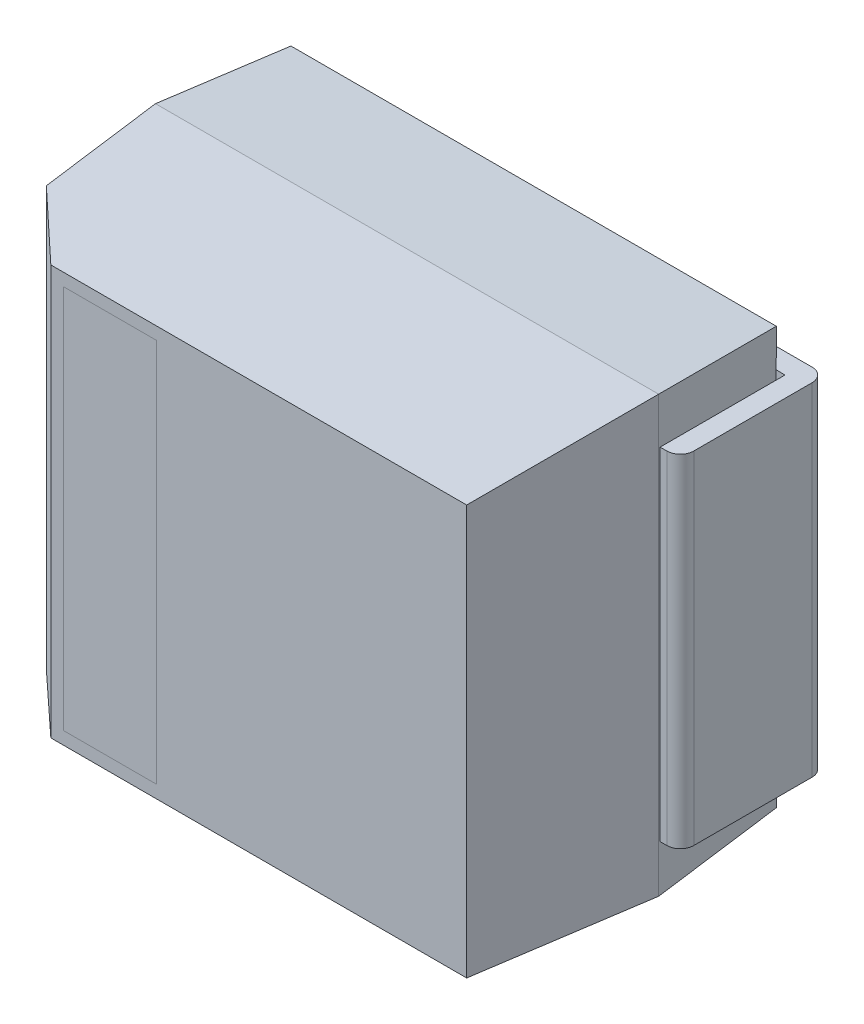
ISO-10303-21;
HEADER;
FILE_DESCRIPTION(('STEP AP214'),'2;1');
FILE_NAME('part.step','',(''),(''),'','','');
FILE_SCHEMA(('AUTOMOTIVE_DESIGN { 1 0 10303 214 1 1 1 1 }'));
ENDSEC;
DATA;
#1=APPLICATION_CONTEXT('core data for automotive mechanical design processes');
#2=APPLICATION_PROTOCOL_DEFINITION('international standard','automotive_design',2000,#1);
#3=PRODUCT_CONTEXT('',#1,'mechanical');
#4=PRODUCT('Part','Part','',(#3));
#5=PRODUCT_RELATED_PRODUCT_CATEGORY('part','',(#4));
#6=PRODUCT_DEFINITION_FORMATION('','',#4);
#7=PRODUCT_DEFINITION_CONTEXT('part definition',#1,'design');
#8=PRODUCT_DEFINITION('design','',#6,#7);
#9=PRODUCT_DEFINITION_SHAPE('','',#8);
#10=(LENGTH_UNIT() NAMED_UNIT(*) SI_UNIT(.MILLI.,.METRE.));
#11=(NAMED_UNIT(*) PLANE_ANGLE_UNIT() SI_UNIT($,.RADIAN.));
#12=(NAMED_UNIT(*) SI_UNIT($,.STERADIAN.) SOLID_ANGLE_UNIT());
#13=UNCERTAINTY_MEASURE_WITH_UNIT(LENGTH_MEASURE(1.E-05),#10,'distance_accuracy_value','');
#14=(GEOMETRIC_REPRESENTATION_CONTEXT(3) GLOBAL_UNCERTAINTY_ASSIGNED_CONTEXT((#13)) GLOBAL_UNIT_ASSIGNED_CONTEXT((#10,
#11,#12)) REPRESENTATION_CONTEXT('',''));
#15=CARTESIAN_POINT('',(0.,0.,0.));
#16=DIRECTION('',(0.,0.,1.));
#17=DIRECTION('',(1.,0.,0.));
#18=AXIS2_PLACEMENT_3D('',#15,#16,#17);
#19=CARTESIAN_POINT('',(-1.62,1.101,0.93655));
#20=DIRECTION('',(1.,0.,0.));
#21=DIRECTION('',(0.,-1.,0.));
#22=AXIS2_PLACEMENT_3D('',#19,#20,#21);
#23=PLANE('',#22);
#24=DIRECTION('',(0.,-1.,0.));
#25=VECTOR('',#24,1.);
#26=CARTESIAN_POINT('',(-1.62,0.,0.93555));
#27=LINE('',#26,#25);
#28=CARTESIAN_POINT('',(-1.62,-0.5,0.93555));
#29=VERTEX_POINT('',#28);
#30=CARTESIAN_POINT('',(-1.62,-1.1,0.93555));
#31=VERTEX_POINT('',#30);
#32=EDGE_CURVE('E462',#29,#31,#27,.T.);
#33=ORIENTED_EDGE('',*,*,#32,.T.);
#34=DIRECTION('',(0.,0.,-1.));
#35=VECTOR('',#34,1.);
#36=CARTESIAN_POINT('',(-1.62,-1.1,0.533425));
#37=LINE('',#36,#35);
#38=CARTESIAN_POINT('',(-1.62,-1.1,0.1313));
#39=VERTEX_POINT('',#38);
#40=EDGE_CURVE('E442',#31,#39,#37,.T.);
#41=ORIENTED_EDGE('',*,*,#40,.T.);
#42=DIRECTION('',(0.,-1.,0.));
#43=VECTOR('',#42,1.);
#44=CARTESIAN_POINT('',(-1.62,0.,0.1313));
#45=LINE('',#44,#43);
#46=CARTESIAN_POINT('',(-1.62,1.1,0.1313));
#47=VERTEX_POINT('',#46);
#48=EDGE_CURVE('E441',#47,#39,#45,.T.);
#49=ORIENTED_EDGE('',*,*,#48,.F.);
#50=DIRECTION('',(0.,0.,1.));
#51=VECTOR('',#50,1.);
#52=CARTESIAN_POINT('',(-1.62,1.1,0.533425));
#53=LINE('',#52,#51);
#54=CARTESIAN_POINT('',(-1.62,1.1,0.93555));
#55=VERTEX_POINT('',#54);
#56=EDGE_CURVE('E465',#47,#55,#53,.T.);
#57=ORIENTED_EDGE('',*,*,#56,.T.);
#58=DIRECTION('',(0.,-1.,0.));
#59=VECTOR('',#58,1.);
#60=CARTESIAN_POINT('',(-1.62,0.,0.93555));
#61=LINE('',#60,#59);
#62=CARTESIAN_POINT('',(-1.62,0.5,0.93555));
#63=VERTEX_POINT('',#62);
#64=EDGE_CURVE('E468',#55,#63,#61,.T.);
#65=ORIENTED_EDGE('',*,*,#64,.T.);
#66=DIRECTION('',(0.,0.,-1.));
#67=VECTOR('',#66,1.);
#68=CARTESIAN_POINT('',(-1.62,0.5,0.533425));
#69=LINE('',#68,#67);
#70=CARTESIAN_POINT('',(-1.62,0.5,0.5));
#71=VERTEX_POINT('',#70);
#72=EDGE_CURVE('E483',#63,#71,#69,.T.);
#73=ORIENTED_EDGE('',*,*,#72,.T.);
#74=DIRECTION('',(0.,-1.,0.));
#75=VECTOR('',#74,1.);
#76=CARTESIAN_POINT('',(-1.62,0.,0.5));
#77=LINE('',#76,#75);
#78=CARTESIAN_POINT('',(-1.62,-0.5,0.5));
#79=VERTEX_POINT('',#78);
#80=EDGE_CURVE('E478',#71,#79,#77,.T.);
#81=ORIENTED_EDGE('',*,*,#80,.T.);
#82=DIRECTION('',(0.,0.,1.));
#83=VECTOR('',#82,1.);
#84=CARTESIAN_POINT('',(-1.62,-0.5,0.533425));
#85=LINE('',#84,#83);
#86=EDGE_CURVE('E473',#79,#29,#85,.T.);
#87=ORIENTED_EDGE('',*,*,#86,.T.);
#88=EDGE_LOOP('',(#33,#41,#49,#57,#65,#73,#81,#87));
#89=FACE_BOUND('',#88,.T.);
#90=ADVANCED_FACE('F17',(#89),#23,.T.);
#91=CARTESIAN_POINT('',(-1.561820961401,-1.101,0.1313));
#92=DIRECTION('',(0.,0.,1.));
#93=DIRECTION('',(0.,1.,0.));
#94=AXIS2_PLACEMENT_3D('',#91,#92,#93);
#95=PLANE('',#94);
#96=ORIENTED_EDGE('',*,*,#48,.T.);
#97=DIRECTION('',(1.,0.,0.));
#98=VECTOR('',#97,1.);
#99=CARTESIAN_POINT('',(-1.5914104807005,-1.1,0.1313));
#100=LINE('',#99,#98);
#101=CARTESIAN_POINT('',(-1.56277528563014,-1.1,0.13064999999999));
#102=VERTEX_POINT('',#101);
#103=EDGE_CURVE('E445',#39,#102,#100,.T.);
#104=ORIENTED_EDGE('',*,*,#103,.T.);
#105=DIRECTION('',(0.,-1.,0.));
#106=VECTOR('',#105,1.);
#107=CARTESIAN_POINT('',(-1.56282096140156,0.,0.131299999999961));
#108=LINE('',#107,#106);
#109=CARTESIAN_POINT('',(-1.56277528563014,1.1,0.13064999999999));
#110=VERTEX_POINT('',#109);
#111=EDGE_CURVE('E750',#110,#102,#108,.T.);
#112=ORIENTED_EDGE('',*,*,#111,.F.);
#113=DIRECTION('',(-1.,0.,0.));
#114=VECTOR('',#113,1.);
#115=CARTESIAN_POINT('',(-1.5914104807005,1.1,0.1313));
#116=LINE('',#115,#114);
#117=EDGE_CURVE('E438',#110,#47,#116,.T.);
#118=ORIENTED_EDGE('',*,*,#117,.T.);
#119=EDGE_LOOP('',(#96,#104,#112,#118));
#120=FACE_BOUND('',#119,.T.);
#121=ADVANCED_FACE('F515',(#120),#95,.T.);
#122=CARTESIAN_POINT('',(0.235415941433112,-0.446322287876966,0.13));
#123=DIRECTION('',(0.,0.,-1.));
#124=DIRECTION('',(-0.758477335685952,0.651699417868959,0.));
#125=AXIS2_PLACEMENT_3D('',#122,#123,#124);
#126=PLANE('',#125);
#127=DIRECTION('',(0.,-1.,0.));
#128=VECTOR('',#127,1.);
#129=CARTESIAN_POINT('',(-1.562729609859,0.,0.13));
#130=LINE('',#129,#128);
#131=CARTESIAN_POINT('',(-1.562729609859,1.342729609859,0.13));
#132=VERTEX_POINT('',#131);
#133=EDGE_CURVE('E753',#132,#110,#130,.T.);
#134=ORIENTED_EDGE('',*,*,#133,.F.);
#135=DIRECTION('',(-1.,0.,0.));
#136=VECTOR('',#135,1.);
#137=CARTESIAN_POINT('',(0.,1.342729609859,0.13));
#138=LINE('',#137,#136);
#139=CARTESIAN_POINT('',(1.562729609859,1.342729609859,0.13));
#140=VERTEX_POINT('',#139);
#141=EDGE_CURVE('E450',#140,#132,#138,.T.);
#142=ORIENTED_EDGE('',*,*,#141,.F.);
#143=CARTESIAN_POINT('',(1.562729609859,1.342729609859,0.13));
#144=DIRECTION('',(0.,-1.,0.));
#145=VECTOR('',#144,1.);
#146=LINE('',#143,#145);
#147=CARTESIAN_POINT('',(1.56277528563,1.1,0.13065));
#148=VERTEX_POINT('',#147);
#149=EDGE_CURVE('E447',#140,#148,#146,.T.);
#150=ORIENTED_EDGE('',*,*,#149,.T.);
#151=CARTESIAN_POINT('',(1.562729609859,1.1,0.13));
#152=DIRECTION('',(-1.,0.,0.));
#153=VECTOR('',#152,1.);
#154=LINE('',#151,#153);
#155=CARTESIAN_POINT('',(0.9,1.1,0.13));
#156=VERTEX_POINT('',#155);
#157=EDGE_CURVE('E996',#148,#156,#154,.T.);
#158=ORIENTED_EDGE('',*,*,#157,.T.);
#159=CARTESIAN_POINT('',(0.9,1.1,0.13));
#160=DIRECTION('',(-1.,0.,0.));
#161=VECTOR('',#160,1.);
#162=LINE('',#159,#161);
#163=CARTESIAN_POINT('',(0.82,1.1,0.13));
#164=VERTEX_POINT('',#163);
#165=EDGE_CURVE('E995',#156,#164,#162,.T.);
#166=ORIENTED_EDGE('',*,*,#165,.T.);
#167=CARTESIAN_POINT('',(0.820000000000001,1.1,0.13));
#168=DIRECTION('',(-1.,0.,0.));
#169=VECTOR('',#168,1.);
#170=LINE('',#167,#169);
#171=CARTESIAN_POINT('',(-0.82,1.1,0.13));
#172=VERTEX_POINT('',#171);
#173=EDGE_CURVE('E998',#164,#172,#170,.T.);
#174=ORIENTED_EDGE('',*,*,#173,.T.);
#175=CARTESIAN_POINT('',(-0.82,1.1,0.13));
#176=DIRECTION('',(-1.,0.,0.));
#177=VECTOR('',#176,1.);
#178=LINE('',#175,#177);
#179=CARTESIAN_POINT('',(-0.9,1.1,0.13));
#180=VERTEX_POINT('',#179);
#181=EDGE_CURVE('E1378',#172,#180,#178,.T.);
#182=ORIENTED_EDGE('',*,*,#181,.T.);
#183=CARTESIAN_POINT('',(-0.9,1.1,0.13));
#184=DIRECTION('',(-1.,0.,0.));
#185=VECTOR('',#184,1.);
#186=LINE('',#183,#185);
#187=EDGE_CURVE('E547',#180,#110,#186,.T.);
#188=ORIENTED_EDGE('',*,*,#187,.T.);
#189=EDGE_LOOP('',(#134,#142,#150,#158,#166,#174,#182,#188));
#190=FACE_BOUND('',#189,.T.);
#191=ADVANCED_FACE('F504',(#190),#126,.T.);
#192=CARTESIAN_POINT('',(-1.56202863423907,-1.41,0.120024598595532));
#193=DIRECTION('',(-0.997540140446774,0.,-0.0700975619934906));
#194=DIRECTION('',(-0.0700975619934906,0.,0.997540140446774));
#195=AXIS2_PLACEMENT_3D('',#192,#193,#194);
#196=PLANE('',#195);
#197=CARTESIAN_POINT('',(-1.562729609859,-1.342729609859,0.13));
#198=DIRECTION('',(-0.0699259759921662,-0.0699259759921659,0.995098344769544));
#199=VECTOR('',#198,1.);
#200=LINE('',#197,#199);
#201=CARTESIAN_POINT('',(-1.562729609859,-1.342729609859,0.13));
#202=VERTEX_POINT('',#201);
#203=CARTESIAN_POINT('',(-1.62000000000001,-1.4,0.945));
#204=VERTEX_POINT('',#203);
#205=EDGE_CURVE('E561',#202,#204,#200,.T.);
#206=ORIENTED_EDGE('',*,*,#205,.T.);
#207=DIRECTION('',(0.,-1.,0.));
#208=VECTOR('',#207,1.);
#209=CARTESIAN_POINT('',(-1.62,0.,0.945));
#210=LINE('',#209,#208);
#211=CARTESIAN_POINT('',(-1.62,1.4,0.945));
#212=VERTEX_POINT('',#211);
#213=EDGE_CURVE('E432',#212,#204,#210,.T.);
#214=ORIENTED_EDGE('',*,*,#213,.F.);
#215=CARTESIAN_POINT('',(-1.562729609859,1.342729609859,0.13));
#216=DIRECTION('',(-0.0699259759921665,0.0699259759921538,0.995098344769545));
#217=VECTOR('',#216,1.);
#218=LINE('',#215,#217);
#219=EDGE_CURVE('E453',#132,#212,#218,.T.);
#220=ORIENTED_EDGE('',*,*,#219,.F.);
#221=ORIENTED_EDGE('',*,*,#133,.T.);
#222=ORIENTED_EDGE('',*,*,#111,.T.);
#223=CARTESIAN_POINT('',(-1.562729609859,-1.342729609859,0.13));
#224=DIRECTION('',(0.,1.,0.));
#225=VECTOR('',#224,1.);
#226=LINE('',#223,#225);
#227=EDGE_CURVE('E904',#202,#102,#226,.T.);
#228=ORIENTED_EDGE('',*,*,#227,.F.);
#229=EDGE_LOOP('',(#206,#214,#220,#221,#222,#228));
#230=FACE_BOUND('',#229,.T.);
#231=ADVANCED_FACE('F514',(#230),#196,.T.);
#232=CARTESIAN_POINT('',(0.235415941433112,-2.88905189773597,0.13));
#233=DIRECTION('',(0.,0.,-1.));
#234=DIRECTION('',(-0.758477335685951,0.65169941786896,0.));
#235=AXIS2_PLACEMENT_3D('',#232,#233,#234);
#236=PLANE('',#235);
#237=CARTESIAN_POINT('',(0.82,-1.1,0.13));
#238=DIRECTION('',(1.,0.,0.));
#239=VECTOR('',#238,1.);
#240=LINE('',#237,#239);
#241=CARTESIAN_POINT('',(0.82,-1.1,0.13));
#242=VERTEX_POINT('',#241);
#243=CARTESIAN_POINT('',(0.9,-1.1,0.13));
#244=VERTEX_POINT('',#243);
#245=EDGE_CURVE('E575',#242,#244,#240,.T.);
#246=ORIENTED_EDGE('',*,*,#245,.T.);
#247=CARTESIAN_POINT('',(0.9,-1.1,0.13));
#248=DIRECTION('',(1.,0.,0.));
#249=VECTOR('',#248,1.);
#250=LINE('',#247,#249);
#251=CARTESIAN_POINT('',(1.56277528563,-1.1,0.13065));
#252=VERTEX_POINT('',#251);
#253=EDGE_CURVE('E454',#244,#252,#250,.T.);
#254=ORIENTED_EDGE('',*,*,#253,.T.);
#255=CARTESIAN_POINT('',(1.562729609859,-1.1,0.13));
#256=DIRECTION('',(0.,-1.,0.));
#257=VECTOR('',#256,1.);
#258=LINE('',#255,#257);
#259=CARTESIAN_POINT('',(1.562729609859,-1.342729609859,0.13));
#260=VERTEX_POINT('',#259);
#261=EDGE_CURVE('E905',#252,#260,#258,.T.);
#262=ORIENTED_EDGE('',*,*,#261,.T.);
#263=DIRECTION('',(1.,0.,0.));
#264=VECTOR('',#263,1.);
#265=CARTESIAN_POINT('',(0.,-1.342729609859,0.13));
#266=LINE('',#265,#264);
#267=EDGE_CURVE('E435',#202,#260,#266,.T.);
#268=ORIENTED_EDGE('',*,*,#267,.F.);
#269=ORIENTED_EDGE('',*,*,#227,.T.);
#270=CARTESIAN_POINT('',(-1.562729609859,-1.1,0.13));
#271=DIRECTION('',(1.,0.,0.));
#272=VECTOR('',#271,1.);
#273=LINE('',#270,#272);
#274=CARTESIAN_POINT('',(-0.9,-1.1,0.13));
#275=VERTEX_POINT('',#274);
#276=EDGE_CURVE('E903',#102,#275,#273,.T.);
#277=ORIENTED_EDGE('',*,*,#276,.T.);
#278=CARTESIAN_POINT('',(-0.9,-1.1,0.13));
#279=DIRECTION('',(1.,0.,0.));
#280=VECTOR('',#279,1.);
#281=LINE('',#278,#280);
#282=CARTESIAN_POINT('',(-0.82,-1.1,0.13));
#283=VERTEX_POINT('',#282);
#284=EDGE_CURVE('E900',#275,#283,#281,.T.);
#285=ORIENTED_EDGE('',*,*,#284,.T.);
#286=CARTESIAN_POINT('',(-0.820000000000001,-1.1,0.13));
#287=DIRECTION('',(1.,0.,0.));
#288=VECTOR('',#287,1.);
#289=LINE('',#286,#288);
#290=EDGE_CURVE('E624',#283,#242,#289,.T.);
#291=ORIENTED_EDGE('',*,*,#290,.T.);
#292=EDGE_LOOP('',(#246,#254,#262,#268,#269,#277,#285,#291));
#293=FACE_BOUND('',#292,.T.);
#294=ADVANCED_FACE('F580',(#293),#236,.T.);
#295=CARTESIAN_POINT('',(-1.63,1.34202863423907,0.120024598595532));
#296=DIRECTION('',(0.,0.997540140446774,-0.0700975619934785));
#297=DIRECTION('',(0.,0.0700975619934785,0.997540140446774));
#298=AXIS2_PLACEMENT_3D('',#295,#296,#297);
#299=PLANE('',#298);
#300=DIRECTION('',(-1.,0.,0.));
#301=VECTOR('',#300,1.);
#302=CARTESIAN_POINT('',(0.,1.4,0.945));
#303=LINE('',#302,#301);
#304=CARTESIAN_POINT('',(1.62,1.4,0.945));
#305=VERTEX_POINT('',#304);
#306=EDGE_CURVE('E653',#305,#212,#303,.T.);
#307=ORIENTED_EDGE('',*,*,#306,.F.);
#308=CARTESIAN_POINT('',(1.62,1.4,0.945));
#309=DIRECTION('',(-0.0699259759921654,-0.0699259759921538,-0.995098344769545));
#310=VECTOR('',#309,1.);
#311=LINE('',#308,#310);
#312=EDGE_CURVE('E637',#305,#140,#311,.T.);
#313=ORIENTED_EDGE('',*,*,#312,.T.);
#314=ORIENTED_EDGE('',*,*,#141,.T.);
#315=ORIENTED_EDGE('',*,*,#219,.T.);
#316=EDGE_LOOP('',(#307,#313,#314,#315));
#317=FACE_BOUND('',#316,.T.);
#318=ADVANCED_FACE('F589',(#317),#299,.T.);
#319=CARTESIAN_POINT('',(-1.62070097561994,-1.41,0.935024598595533));
#320=DIRECTION('',(-0.997540140446733,0.,0.0700975619940728));
#321=DIRECTION('',(0.0700975619940728,0.,0.997540140446733));
#322=AXIS2_PLACEMENT_3D('',#319,#320,#321);
#323=PLANE('',#322);
#324=CARTESIAN_POINT('',(-1.62,1.4,0.945));
#325=DIRECTION('',(0.0699259759927494,-0.0699259759927508,0.995098344769462));
#326=VECTOR('',#325,1.);
#327=LINE('',#324,#326);
#328=CARTESIAN_POINT('',(-1.5668766930134,1.34687669301349,1.7009839401685));
#329=VERTEX_POINT('',#328);
#330=EDGE_CURVE('E713',#212,#329,#327,.T.);
#331=ORIENTED_EDGE('',*,*,#330,.F.);
#332=ORIENTED_EDGE('',*,*,#213,.T.);
#333=CARTESIAN_POINT('',(-1.62,-1.4,0.945));
#334=DIRECTION('',(0.0699259759927439,0.0699259759927488,0.995098344769462));
#335=VECTOR('',#334,1.);
#336=LINE('',#333,#335);
#337=CARTESIAN_POINT('',(-1.5668766914158,-1.3468766926689,1.70098394507107));
#338=VERTEX_POINT('',#337);
#339=EDGE_CURVE('E354',#204,#338,#336,.T.);
#340=ORIENTED_EDGE('',*,*,#339,.T.);
#341=DIRECTION('',(0.,-1.,0.));
#342=VECTOR('',#341,1.);
#343=CARTESIAN_POINT('',(-1.56687669275667,0.,1.7009839438213));
#344=LINE('',#343,#342);
#345=EDGE_CURVE('E422',#329,#338,#344,.T.);
#346=ORIENTED_EDGE('',*,*,#345,.F.);
#347=EDGE_LOOP('',(#331,#332,#340,#346));
#348=FACE_BOUND('',#347,.T.);
#349=ADVANCED_FACE('F687',(#348),#323,.T.);
#350=CARTESIAN_POINT('',(-1.63,-1.40070097561993,0.954975401404468));
#351=DIRECTION('',(0.,-0.997540140446774,-0.0700975619934785));
#352=DIRECTION('',(0.,0.0700975619934785,-0.997540140446774));
#353=AXIS2_PLACEMENT_3D('',#350,#351,#352);
#354=PLANE('',#353);
#355=DIRECTION('',(1.,0.,0.));
#356=VECTOR('',#355,1.);
#357=CARTESIAN_POINT('',(0.,-1.4,0.945));
#358=LINE('',#357,#356);
#359=CARTESIAN_POINT('',(1.62,-1.4,0.945));
#360=VERTEX_POINT('',#359);
#361=EDGE_CURVE('E423',#204,#360,#358,.T.);
#362=ORIENTED_EDGE('',*,*,#361,.F.);
#363=ORIENTED_EDGE('',*,*,#205,.F.);
#364=ORIENTED_EDGE('',*,*,#267,.T.);
#365=CARTESIAN_POINT('',(1.562729609859,-1.342729609859,0.13));
#366=DIRECTION('',(0.0699259759921659,-0.0699259759921537,0.995098344769545));
#367=VECTOR('',#366,1.);
#368=LINE('',#365,#367);
#369=EDGE_CURVE('E714',#260,#360,#368,.T.);
#370=ORIENTED_EDGE('',*,*,#369,.T.);
#371=EDGE_LOOP('',(#362,#363,#364,#370));
#372=FACE_BOUND('',#371,.T.);
#373=ADVANCED_FACE('F324',(#372),#354,.T.);
#374=CARTESIAN_POINT('',(-1.63,1.40070097561994,0.935024598595533));
#375=DIRECTION('',(0.,0.997540140446732,0.0700975619940795));
#376=DIRECTION('',(0.,-0.0700975619940795,0.997540140446732));
#377=AXIS2_PLACEMENT_3D('',#374,#375,#376);
#378=PLANE('',#377);
#379=CARTESIAN_POINT('',(1.538837667959,1.318837667959,2.1));
#380=DIRECTION('',(0.0699259759927525,0.0699259759927507,-0.995098344769462));
#381=VECTOR('',#380,1.);
#382=LINE('',#379,#381);
#383=CARTESIAN_POINT('',(1.538837667834,1.318837667959,2.1));
#384=VERTEX_POINT('',#383);
#385=EDGE_CURVE('E657',#384,#305,#382,.T.);
#386=ORIENTED_EDGE('',*,*,#385,.T.);
#387=ORIENTED_EDGE('',*,*,#306,.T.);
#388=ORIENTED_EDGE('',*,*,#330,.T.);
#389=CARTESIAN_POINT('',(-1.138837667959,1.318837667959,2.1));
#390=DIRECTION('',(-0.730632039953568,0.0478606124666764,-0.681091905668834));
#391=VECTOR('',#390,1.);
#392=LINE('',#389,#391);
#393=CARTESIAN_POINT('',(-1.138837667834,1.318837667959,2.1));
#394=VERTEX_POINT('',#393);
#395=EDGE_CURVE('E656',#394,#329,#392,.T.);
#396=ORIENTED_EDGE('',*,*,#395,.F.);
#397=CARTESIAN_POINT('',(1.538837667959,1.318837667959,2.1));
#398=DIRECTION('',(-1.,0.,0.));
#399=VECTOR('',#398,1.);
#400=LINE('',#397,#399);
#401=EDGE_CURVE('E306',#384,#394,#400,.T.);
#402=ORIENTED_EDGE('',*,*,#401,.F.);
#403=EDGE_LOOP('',(#386,#387,#388,#396,#402));
#404=FACE_BOUND('',#403,.T.);
#405=ADVANCED_FACE('F313',(#404),#378,.T.);
#406=CARTESIAN_POINT('',(-1.57419139562859,-1.356876692757,1.69416521066151));
#407=DIRECTION('',(-0.68187331594874,0.,0.73147028715941));
#408=DIRECTION('',(0.73147028715941,0.,0.68187331594874));
#409=AXIS2_PLACEMENT_3D('',#406,#407,#408);
#410=PLANE('',#409);
#411=CARTESIAN_POINT('',(-1.138837667959,-1.318837667959,2.1));
#412=DIRECTION('',(-0.730632039953578,-0.047860612466089,-0.681091905668863));
#413=VECTOR('',#412,1.);
#414=LINE('',#411,#413);
#415=CARTESIAN_POINT('',(-1.138837667959,-1.318837667834,2.1));
#416=VERTEX_POINT('',#415);
#417=EDGE_CURVE('E386',#416,#338,#414,.T.);
#418=ORIENTED_EDGE('',*,*,#417,.F.);
#419=CARTESIAN_POINT('',(-1.138837667959,1.318837667959,2.1));
#420=DIRECTION('',(0.,-1.,0.));
#421=VECTOR('',#420,1.);
#422=LINE('',#419,#421);
#423=EDGE_CURVE('E419',#394,#416,#422,.T.);
#424=ORIENTED_EDGE('',*,*,#423,.F.);
#425=ORIENTED_EDGE('',*,*,#395,.T.);
#426=ORIENTED_EDGE('',*,*,#345,.T.);
#427=EDGE_LOOP('',(#418,#424,#425,#426));
#428=FACE_BOUND('',#427,.T.);
#429=ADVANCED_FACE('F323',(#428),#410,.T.);
#430=CARTESIAN_POINT('',(-1.63,-1.31813669233906,2.10997540140447));
#431=DIRECTION('',(0.,-0.997540140446732,0.0700975619940795));
#432=DIRECTION('',(0.,-0.0700975619940795,-0.997540140446732));
#433=AXIS2_PLACEMENT_3D('',#430,#431,#432);
#434=PLANE('',#433);
#435=ORIENTED_EDGE('',*,*,#361,.T.);
#436=CARTESIAN_POINT('',(1.62,-1.4,0.945));
#437=DIRECTION('',(-0.069925975992753,0.0699259759927507,0.995098344769461));
#438=VECTOR('',#437,1.);
#439=LINE('',#436,#438);
#440=CARTESIAN_POINT('',(1.538837667834,-1.318837667959,2.1));
#441=VERTEX_POINT('',#440);
#442=EDGE_CURVE('E112',#360,#441,#439,.T.);
#443=ORIENTED_EDGE('',*,*,#442,.T.);
#444=CARTESIAN_POINT('',(-1.138837667959,-1.318837667959,2.1));
#445=DIRECTION('',(1.,0.,0.));
#446=VECTOR('',#445,1.);
#447=LINE('',#444,#446);
#448=EDGE_CURVE('E242',#416,#441,#447,.T.);
#449=ORIENTED_EDGE('',*,*,#448,.F.);
#450=ORIENTED_EDGE('',*,*,#417,.T.);
#451=ORIENTED_EDGE('',*,*,#339,.F.);
#452=EDGE_LOOP('',(#435,#443,#449,#450,#451));
#453=FACE_BOUND('',#452,.T.);
#454=ADVANCED_FACE('F359',(#453),#434,.T.);
#455=CARTESIAN_POINT('',(-1.62558725083247,1.10104818124268,2.0987));
#456=DIRECTION('',(0.,0.,1.));
#457=DIRECTION('',(0.235568501486011,-0.971857747362049,0.));
#458=AXIS2_PLACEMENT_3D('',#455,#456,#457);
#459=PLANE('',#458);
#460=CARTESIAN_POINT('',(-1.057675335919,-1.237675335919,2.1));
#461=DIRECTION('',(0.,1.,0.));
#462=VECTOR('',#461,1.);
#463=LINE('',#460,#462);
#464=CARTESIAN_POINT('',(-1.057675335794,-1.237675335919,2.09935));
#465=VERTEX_POINT('',#464);
#466=CARTESIAN_POINT('',(-1.057675335794,1.237675335919,2.09935));
#467=VERTEX_POINT('',#466);
#468=EDGE_CURVE('E237',#465,#467,#463,.T.);
#469=ORIENTED_EDGE('',*,*,#468,.F.);
#470=CARTESIAN_POINT('',(-0.457675335919,-1.237675335919,2.1));
#471=DIRECTION('',(-1.,0.,0.));
#472=VECTOR('',#471,1.);
#473=LINE('',#470,#472);
#474=CARTESIAN_POINT('',(-0.457675335919,-1.237675335919,2.09935));
#475=VERTEX_POINT('',#474);
#476=EDGE_CURVE('E248',#475,#465,#473,.T.);
#477=ORIENTED_EDGE('',*,*,#476,.F.);
#478=CARTESIAN_POINT('',(-0.457675335918999,1.237675335919,2.1));
#479=DIRECTION('',(0.,-1.,0.));
#480=VECTOR('',#479,1.);
#481=LINE('',#478,#480);
#482=CARTESIAN_POINT('',(-0.457675335918999,1.237675335919,2.09935));
#483=VERTEX_POINT('',#482);
#484=EDGE_CURVE('E230',#483,#475,#481,.T.);
#485=ORIENTED_EDGE('',*,*,#484,.F.);
#486=CARTESIAN_POINT('',(-1.057675335919,1.237675335919,2.1));
#487=DIRECTION('',(1.,0.,0.));
#488=VECTOR('',#487,1.);
#489=LINE('',#486,#488);
#490=EDGE_CURVE('E233',#467,#483,#489,.T.);
#491=ORIENTED_EDGE('',*,*,#490,.F.);
#492=EDGE_LOOP('',(#469,#477,#485,#491));
#493=FACE_BOUND('',#492,.T.);
#494=ADVANCED_FACE('F236',(#493),#459,.T.);
#495=CARTESIAN_POINT('',(-2.44354453488852,-0.201975287543792,2.1));
#496=DIRECTION('',(0.,0.,1.));
#497=DIRECTION('',(0.75929708471403,-0.650744141076026,0.));
#498=AXIS2_PLACEMENT_3D('',#495,#496,#497);
#499=PLANE('',#498);
#500=ORIENTED_EDGE('',*,*,#476,.T.);
#501=ORIENTED_EDGE('',*,*,#468,.T.);
#502=ORIENTED_EDGE('',*,*,#490,.T.);
#503=ORIENTED_EDGE('',*,*,#484,.T.);
#504=EDGE_LOOP('',(#500,#501,#502,#503));
#505=FACE_BOUND('',#504,.T.);
#506=ORIENTED_EDGE('',*,*,#448,.T.);
#507=DIRECTION('',(0.,-1.,0.));
#508=VECTOR('',#507,1.);
#509=CARTESIAN_POINT('',(1.538837667959,0.,2.1));
#510=LINE('',#509,#508);
#511=EDGE_CURVE('E717',#384,#441,#510,.T.);
#512=ORIENTED_EDGE('',*,*,#511,.F.);
#513=ORIENTED_EDGE('',*,*,#401,.T.);
#514=ORIENTED_EDGE('',*,*,#423,.T.);
#515=EDGE_LOOP('',(#506,#512,#513,#514));
#516=FACE_BOUND('',#515,.T.);
#517=ADVANCED_FACE('F246',(#505,#516),#499,.T.);
#518=CARTESIAN_POINT('',(-1.751,-0.5,0.93655));
#519=DIRECTION('',(0.,1.,0.));
#520=DIRECTION('',(1.,0.,0.));
#521=AXIS2_PLACEMENT_3D('',#518,#519,#520);
#522=PLANE('',#521);
#523=DIRECTION('',(-1.,0.,0.));
#524=VECTOR('',#523,1.);
#525=CARTESIAN_POINT('',(-1.6416666666665,-0.5,0.93555));
#526=LINE('',#525,#524);
#527=CARTESIAN_POINT('',(-1.663333333333,-0.5,0.935549999999835));
#528=VERTEX_POINT('',#527);
#529=EDGE_CURVE('E101',#29,#528,#526,.T.);
#530=ORIENTED_EDGE('',*,*,#529,.F.);
#531=ORIENTED_EDGE('',*,*,#86,.F.);
#532=DIRECTION('',(1.,0.,0.));
#533=VECTOR('',#532,1.);
#534=CARTESIAN_POINT('',(-1.685,-0.5,0.5));
#535=LINE('',#534,#533);
#536=CARTESIAN_POINT('',(-1.75,-0.5,0.5));
#537=VERTEX_POINT('',#536);
#538=EDGE_CURVE('E250',#537,#79,#535,.T.);
#539=ORIENTED_EDGE('',*,*,#538,.F.);
#540=DIRECTION('',(0.,0.,-1.));
#541=VECTOR('',#540,1.);
#542=CARTESIAN_POINT('',(-1.75,-0.5,0.467774999999835));
#543=LINE('',#542,#541);
#544=CARTESIAN_POINT('',(-1.75,-0.5,0.848883333333));
#545=VERTEX_POINT('',#544);
#546=EDGE_CURVE('E738',#545,#537,#543,.T.);
#547=ORIENTED_EDGE('',*,*,#546,.F.);
#548=CARTESIAN_POINT('',(-1.663333333333,-0.5,0.848883333333));
#549=DIRECTION('',(0.,-1.,0.));
#550=DIRECTION('',(0.,0.,-1.));
#551=AXIS2_PLACEMENT_3D('',#548,#549,#550);
#552=CIRCLE('',#551,0.0866666666666699);
#553=EDGE_CURVE('E963',#528,#545,#552,.T.);
#554=ORIENTED_EDGE('',*,*,#553,.F.);
#555=EDGE_LOOP('',(#530,#531,#539,#547,#554));
#556=FACE_BOUND('',#555,.T.);
#557=ADVANCED_FACE('F268',(#556),#522,.T.);
#558=CARTESIAN_POINT('',(-1.619,-0.501,0.5));
#559=DIRECTION('',(0.,0.,1.));
#560=DIRECTION('',(0.,1.,0.));
#561=AXIS2_PLACEMENT_3D('',#558,#559,#560);
#562=PLANE('',#561);
#563=DIRECTION('',(1.,0.,0.));
#564=VECTOR('',#563,1.);
#565=CARTESIAN_POINT('',(-1.685,0.5,0.5));
#566=LINE('',#565,#564);
#567=CARTESIAN_POINT('',(-1.75,0.5,0.5));
#568=VERTEX_POINT('',#567);
#569=EDGE_CURVE('E718',#568,#71,#566,.T.);
#570=ORIENTED_EDGE('',*,*,#569,.F.);
#571=DIRECTION('',(0.,1.,0.));
#572=VECTOR('',#571,1.);
#573=CARTESIAN_POINT('',(-1.75,0.,0.5));
#574=LINE('',#573,#572);
#575=EDGE_CURVE('E734',#537,#568,#574,.T.);
#576=ORIENTED_EDGE('',*,*,#575,.F.);
#577=ORIENTED_EDGE('',*,*,#538,.T.);
#578=ORIENTED_EDGE('',*,*,#80,.F.);
#579=EDGE_LOOP('',(#570,#576,#577,#578));
#580=FACE_BOUND('',#579,.T.);
#581=ADVANCED_FACE('F1216',(#580),#562,.T.);
#582=CARTESIAN_POINT('',(-1.619,0.5,0.93655));
#583=DIRECTION('',(0.,-1.,0.));
#584=DIRECTION('',(-1.,0.,0.));
#585=AXIS2_PLACEMENT_3D('',#582,#583,#584);
#586=PLANE('',#585);
#587=CARTESIAN_POINT('',(-1.663333333333,0.5,0.848883333333));
#588=DIRECTION('',(0.,-1.,0.));
#589=DIRECTION('',(0.,0.,-1.));
#590=AXIS2_PLACEMENT_3D('',#587,#588,#589);
#591=CIRCLE('',#590,0.0866666666666699);
#592=CARTESIAN_POINT('',(-1.74999999999984,0.5,0.848883333333));
#593=VERTEX_POINT('',#592);
#594=CARTESIAN_POINT('',(-1.663333333333,0.5,0.93555));
#595=VERTEX_POINT('',#594);
#596=EDGE_CURVE('E954',#593,#595,#591,.F.);
#597=ORIENTED_EDGE('',*,*,#596,.F.);
#598=DIRECTION('',(0.,0.,1.));
#599=VECTOR('',#598,1.);
#600=CARTESIAN_POINT('',(-1.75,0.5,0.467774999999835));
#601=LINE('',#600,#599);
#602=EDGE_CURVE('E737',#568,#593,#601,.T.);
#603=ORIENTED_EDGE('',*,*,#602,.F.);
#604=ORIENTED_EDGE('',*,*,#569,.T.);
#605=ORIENTED_EDGE('',*,*,#72,.F.);
#606=DIRECTION('',(1.,0.,0.));
#607=VECTOR('',#606,1.);
#608=CARTESIAN_POINT('',(-1.6416666666665,0.5,0.93555));
#609=LINE('',#608,#607);
#610=EDGE_CURVE('E950',#595,#63,#609,.T.);
#611=ORIENTED_EDGE('',*,*,#610,.F.);
#612=EDGE_LOOP('',(#597,#603,#604,#605,#611));
#613=FACE_BOUND('',#612,.T.);
#614=ADVANCED_FACE('F976',(#613),#586,.T.);
#615=CARTESIAN_POINT('',(1.53813669233906,-1.41,2.10997540140447));
#616=DIRECTION('',(0.997540140446732,0.,0.0700975619940797));
#617=DIRECTION('',(0.0700975619940797,0.,-0.997540140446732));
#618=AXIS2_PLACEMENT_3D('',#615,#616,#617);
#619=PLANE('',#618);
#620=ORIENTED_EDGE('',*,*,#511,.T.);
#621=ORIENTED_EDGE('',*,*,#442,.F.);
#622=DIRECTION('',(0.,-1.,0.));
#623=VECTOR('',#622,1.);
#624=CARTESIAN_POINT('',(1.62000000000001,0.,0.945));
#625=LINE('',#624,#623);
#626=EDGE_CURVE('E641',#305,#360,#625,.T.);
#627=ORIENTED_EDGE('',*,*,#626,.F.);
#628=ORIENTED_EDGE('',*,*,#385,.F.);
#629=EDGE_LOOP('',(#620,#621,#627,#628));
#630=FACE_BOUND('',#629,.T.);
#631=ADVANCED_FACE('F769',(#630),#619,.T.);
#632=CARTESIAN_POINT('',(-1.619,-1.101,0.93555));
#633=DIRECTION('',(0.,0.,1.));
#634=DIRECTION('',(0.,1.,0.));
#635=AXIS2_PLACEMENT_3D('',#632,#633,#634);
#636=PLANE('',#635);
#637=ORIENTED_EDGE('',*,*,#529,.T.);
#638=DIRECTION('',(0.,1.,0.));
#639=VECTOR('',#638,1.);
#640=CARTESIAN_POINT('',(-1.663333333333,-0.8,0.93554999999967));
#641=LINE('',#640,#639);
#642=CARTESIAN_POINT('',(-1.663333333333,-1.1,0.935549999999835));
#643=VERTEX_POINT('',#642);
#644=EDGE_CURVE('E720',#643,#528,#641,.T.);
#645=ORIENTED_EDGE('',*,*,#644,.F.);
#646=DIRECTION('',(-1.,0.,0.));
#647=VECTOR('',#646,1.);
#648=CARTESIAN_POINT('',(-1.325,-1.1,0.93555));
#649=LINE('',#648,#647);
#650=EDGE_CURVE('E938',#31,#643,#649,.T.);
#651=ORIENTED_EDGE('',*,*,#650,.F.);
#652=ORIENTED_EDGE('',*,*,#32,.F.);
#653=EDGE_LOOP('',(#637,#645,#651,#652));
#654=FACE_BOUND('',#653,.T.);
#655=ADVANCED_FACE('F1004',(#654),#636,.T.);
#656=CARTESIAN_POINT('',(-1.663333333333,-0.5,0.848883333333));
#657=DIRECTION('',(0.,-1.,0.));
#658=DIRECTION('',(0.,0.,-1.));
#659=AXIS2_PLACEMENT_3D('',#656,#657,#658);
#660=CYLINDRICAL_SURFACE('',#659,0.0866666666666699);
#661=ORIENTED_EDGE('',*,*,#644,.T.);
#662=ORIENTED_EDGE('',*,*,#553,.T.);
#663=DIRECTION('',(0.,1.,0.));
#664=VECTOR('',#663,1.);
#665=CARTESIAN_POINT('',(-1.75,0.,0.848883333333));
#666=LINE('',#665,#664);
#667=CARTESIAN_POINT('',(-1.75,-1.1,0.848883333333));
#668=VERTEX_POINT('',#667);
#669=EDGE_CURVE('E745',#668,#545,#666,.T.);
#670=ORIENTED_EDGE('',*,*,#669,.F.);
#671=CARTESIAN_POINT('',(-1.663333333333,-1.1,0.848883333333));
#672=DIRECTION('',(0.,-1.,0.));
#673=DIRECTION('',(0.,0.,-1.));
#674=AXIS2_PLACEMENT_3D('',#671,#672,#673);
#675=CIRCLE('',#674,0.0866666666666699);
#676=EDGE_CURVE('E941',#643,#668,#675,.T.);
#677=ORIENTED_EDGE('',*,*,#676,.F.);
#678=EDGE_LOOP('',(#661,#662,#670,#677));
#679=FACE_BOUND('',#678,.T.);
#680=ADVANCED_FACE('F1009',(#679),#660,.T.);
#681=CARTESIAN_POINT('',(-1.75,-1.101,0.849883333333));
#682=DIRECTION('',(-1.,0.,0.));
#683=DIRECTION('',(0.,1.,0.));
#684=AXIS2_PLACEMENT_3D('',#681,#682,#683);
#685=PLANE('',#684);
#686=DIRECTION('',(0.,-1.,0.));
#687=VECTOR('',#686,1.);
#688=CARTESIAN_POINT('',(-1.74999999999967,0.8,0.848883333333));
#689=LINE('',#688,#687);
#690=CARTESIAN_POINT('',(-1.74999999999984,1.1,0.848883333333));
#691=VERTEX_POINT('',#690);
#692=EDGE_CURVE('E951',#691,#593,#689,.T.);
#693=ORIENTED_EDGE('',*,*,#692,.F.);
#694=DIRECTION('',(0.,0.,-1.));
#695=VECTOR('',#694,1.);
#696=CARTESIAN_POINT('',(-1.75,1.1,0.467774999999835));
#697=LINE('',#696,#695);
#698=CARTESIAN_POINT('',(-1.74999999999984,1.1,0.0866666666666702));
#699=VERTEX_POINT('',#698);
#700=EDGE_CURVE('E955',#691,#699,#697,.T.);
#701=ORIENTED_EDGE('',*,*,#700,.T.);
#702=DIRECTION('',(0.,1.,0.));
#703=VECTOR('',#702,1.);
#704=CARTESIAN_POINT('',(-1.74999999999967,0.,0.08666666666667));
#705=LINE('',#704,#703);
#706=CARTESIAN_POINT('',(-1.74999999999984,-1.1,0.0866666666666702));
#707=VERTEX_POINT('',#706);
#708=EDGE_CURVE('E956',#707,#699,#705,.T.);
#709=ORIENTED_EDGE('',*,*,#708,.F.);
#710=DIRECTION('',(0.,0.,-1.));
#711=VECTOR('',#710,1.);
#712=CARTESIAN_POINT('',(-1.75,-1.1,0.467775));
#713=LINE('',#712,#711);
#714=EDGE_CURVE('E649',#668,#707,#713,.T.);
#715=ORIENTED_EDGE('',*,*,#714,.F.);
#716=ORIENTED_EDGE('',*,*,#669,.T.);
#717=ORIENTED_EDGE('',*,*,#546,.T.);
#718=ORIENTED_EDGE('',*,*,#575,.T.);
#719=ORIENTED_EDGE('',*,*,#602,.T.);
#720=EDGE_LOOP('',(#693,#701,#709,#715,#716,#717,#718,#719));
#721=FACE_BOUND('',#720,.T.);
#722=ADVANCED_FACE('F972',(#721),#685,.T.);
#723=CARTESIAN_POINT('',(-1.663333333333,1.1,0.848883333333));
#724=DIRECTION('',(0.,-1.,0.));
#725=DIRECTION('',(0.,0.,-1.));
#726=AXIS2_PLACEMENT_3D('',#723,#724,#725);
#727=CYLINDRICAL_SURFACE('',#726,0.0866666666666699);
#728=DIRECTION('',(0.,-1.,0.));
#729=VECTOR('',#728,1.);
#730=CARTESIAN_POINT('',(-1.663333333333,0.8,0.93555));
#731=LINE('',#730,#729);
#732=CARTESIAN_POINT('',(-1.663333333333,1.1,0.93555));
#733=VERTEX_POINT('',#732);
#734=EDGE_CURVE('E650',#733,#595,#731,.T.);
#735=ORIENTED_EDGE('',*,*,#734,.F.);
#736=CARTESIAN_POINT('',(-1.663333333333,1.1,0.848883333333));
#737=DIRECTION('',(0.,-1.,0.));
#738=DIRECTION('',(0.,0.,-1.));
#739=AXIS2_PLACEMENT_3D('',#736,#737,#738);
#740=CIRCLE('',#739,0.0866666666666699);
#741=EDGE_CURVE('E933',#691,#733,#740,.F.);
#742=ORIENTED_EDGE('',*,*,#741,.F.);
#743=ORIENTED_EDGE('',*,*,#692,.T.);
#744=ORIENTED_EDGE('',*,*,#596,.T.);
#745=EDGE_LOOP('',(#735,#742,#743,#744));
#746=FACE_BOUND('',#745,.T.);
#747=ADVANCED_FACE('F979',(#746),#727,.T.);
#748=CARTESIAN_POINT('',(-1.619,0.499,0.93555));
#749=DIRECTION('',(0.,0.,1.));
#750=DIRECTION('',(0.,1.,0.));
#751=AXIS2_PLACEMENT_3D('',#748,#749,#750);
#752=PLANE('',#751);
#753=DIRECTION('',(1.,0.,0.));
#754=VECTOR('',#753,1.);
#755=CARTESIAN_POINT('',(-1.325,1.1,0.93555));
#756=LINE('',#755,#754);
#757=EDGE_CURVE('E917',#733,#55,#756,.T.);
#758=ORIENTED_EDGE('',*,*,#757,.F.);
#759=ORIENTED_EDGE('',*,*,#734,.T.);
#760=ORIENTED_EDGE('',*,*,#610,.T.);
#761=ORIENTED_EDGE('',*,*,#64,.F.);
#762=EDGE_LOOP('',(#758,#759,#760,#761));
#763=FACE_BOUND('',#762,.T.);
#764=ADVANCED_FACE('F796',(#763),#752,.T.);
#765=CARTESIAN_POINT('',(1.62070097561994,-1.41,0.954975401404468));
#766=DIRECTION('',(0.997540140446774,0.,-0.0700975619934906));
#767=DIRECTION('',(-0.0700975619934906,0.,-0.997540140446774));
#768=AXIS2_PLACEMENT_3D('',#765,#766,#767);
#769=PLANE('',#768);
#770=ORIENTED_EDGE('',*,*,#312,.F.);
#771=ORIENTED_EDGE('',*,*,#626,.T.);
#772=ORIENTED_EDGE('',*,*,#369,.F.);
#773=ORIENTED_EDGE('',*,*,#261,.F.);
#774=DIRECTION('',(0.,-1.,0.));
#775=VECTOR('',#774,1.);
#776=CARTESIAN_POINT('',(1.562820961401,0.,0.1313));
#777=LINE('',#776,#775);
#778=EDGE_CURVE('E907',#148,#252,#777,.T.);
#779=ORIENTED_EDGE('',*,*,#778,.F.);
#780=ORIENTED_EDGE('',*,*,#149,.F.);
#781=EDGE_LOOP('',(#770,#771,#772,#773,#779,#780));
#782=FACE_BOUND('',#781,.T.);
#783=ADVANCED_FACE('F772',(#782),#769,.T.);
#784=CARTESIAN_POINT('',(-1.663333333333,1.1,0.0866666666666703));
#785=DIRECTION('',(0.,-1.,0.));
#786=DIRECTION('',(0.,0.,-1.));
#787=AXIS2_PLACEMENT_3D('',#784,#785,#786);
#788=CYLINDRICAL_SURFACE('',#787,0.0866666666666699);
#789=DIRECTION('',(0.,1.,0.));
#790=VECTOR('',#789,1.);
#791=CARTESIAN_POINT('',(-1.663333333333,0.,0.));
#792=LINE('',#791,#790);
#793=CARTESIAN_POINT('',(-1.663333333333,-1.1,0.));
#794=VERTEX_POINT('',#793);
#795=CARTESIAN_POINT('',(-1.663333333333,1.1,0.));
#796=VERTEX_POINT('',#795);
#797=EDGE_CURVE('E924',#794,#796,#792,.T.);
#798=ORIENTED_EDGE('',*,*,#797,.F.);
#799=CARTESIAN_POINT('',(-1.663333333333,-1.1,0.0866666666666703));
#800=DIRECTION('',(0.,-1.,0.));
#801=DIRECTION('',(0.,0.,-1.));
#802=AXIS2_PLACEMENT_3D('',#799,#800,#801);
#803=CIRCLE('',#802,0.0866666666666699);
#804=EDGE_CURVE('E959',#794,#707,#803,.F.);
#805=ORIENTED_EDGE('',*,*,#804,.T.);
#806=ORIENTED_EDGE('',*,*,#708,.T.);
#807=CARTESIAN_POINT('',(-1.663333333333,1.1,0.0866666666666703));
#808=DIRECTION('',(0.,-1.,0.));
#809=DIRECTION('',(0.,0.,-1.));
#810=AXIS2_PLACEMENT_3D('',#807,#808,#809);
#811=CIRCLE('',#810,0.0866666666666699);
#812=EDGE_CURVE('E982',#796,#699,#811,.F.);
#813=ORIENTED_EDGE('',*,*,#812,.F.);
#814=EDGE_LOOP('',(#798,#805,#806,#813));
#815=FACE_BOUND('',#814,.T.);
#816=ADVANCED_FACE('F795',(#815),#788,.T.);
#817=CARTESIAN_POINT('',(1.561820961401,1.101,0.1313));
#818=DIRECTION('',(0.,0.,1.));
#819=DIRECTION('',(0.,-1.,0.));
#820=AXIS2_PLACEMENT_3D('',#817,#818,#819);
#821=PLANE('',#820);
#822=DIRECTION('',(0.,-1.,0.));
#823=VECTOR('',#822,1.);
#824=CARTESIAN_POINT('',(1.62,0.,0.1313));
#825=LINE('',#824,#823);
#826=CARTESIAN_POINT('',(1.62,1.1,0.1313));
#827=VERTEX_POINT('',#826);
#828=CARTESIAN_POINT('',(1.62,-1.1,0.1313));
#829=VERTEX_POINT('',#828);
#830=EDGE_CURVE('E937',#827,#829,#825,.T.);
#831=ORIENTED_EDGE('',*,*,#830,.F.);
#832=DIRECTION('',(-1.,0.,0.));
#833=VECTOR('',#832,1.);
#834=CARTESIAN_POINT('',(1.5914104807005,1.1,0.1313));
#835=LINE('',#834,#833);
#836=EDGE_CURVE('E916',#827,#148,#835,.T.);
#837=ORIENTED_EDGE('',*,*,#836,.T.);
#838=ORIENTED_EDGE('',*,*,#778,.T.);
#839=DIRECTION('',(1.,0.,0.));
#840=VECTOR('',#839,1.);
#841=CARTESIAN_POINT('',(1.5914104807005,-1.1,0.1313));
#842=LINE('',#841,#840);
#843=EDGE_CURVE('E913',#252,#829,#842,.T.);
#844=ORIENTED_EDGE('',*,*,#843,.T.);
#845=EDGE_LOOP('',(#831,#837,#838,#844));
#846=FACE_BOUND('',#845,.T.);
#847=ADVANCED_FACE('F912',(#846),#821,.T.);
#848=CARTESIAN_POINT('',(1.62,-1.101,0.93655));
#849=DIRECTION('',(-1.,0.,0.));
#850=DIRECTION('',(0.,1.,0.));
#851=AXIS2_PLACEMENT_3D('',#848,#849,#850);
#852=PLANE('',#851);
#853=DIRECTION('',(0.,-1.,0.));
#854=VECTOR('',#853,1.);
#855=CARTESIAN_POINT('',(1.62,0.,0.93555));
#856=LINE('',#855,#854);
#857=CARTESIAN_POINT('',(1.62,1.1,0.93555));
#858=VERTEX_POINT('',#857);
#859=CARTESIAN_POINT('',(1.62,-1.1,0.93555));
#860=VERTEX_POINT('',#859);
#861=EDGE_CURVE('E1041',#858,#860,#856,.T.);
#862=ORIENTED_EDGE('',*,*,#861,.F.);
#863=DIRECTION('',(0.,0.,-1.));
#864=VECTOR('',#863,1.);
#865=CARTESIAN_POINT('',(1.62,1.1,0.533425));
#866=LINE('',#865,#864);
#867=EDGE_CURVE('E1047',#858,#827,#866,.T.);
#868=ORIENTED_EDGE('',*,*,#867,.T.);
#869=ORIENTED_EDGE('',*,*,#830,.T.);
#870=DIRECTION('',(0.,0.,1.));
#871=VECTOR('',#870,1.);
#872=CARTESIAN_POINT('',(1.62,-1.1,0.533425));
#873=LINE('',#872,#871);
#874=EDGE_CURVE('E921',#829,#860,#873,.T.);
#875=ORIENTED_EDGE('',*,*,#874,.T.);
#876=EDGE_LOOP('',(#862,#868,#869,#875));
#877=FACE_BOUND('',#876,.T.);
#878=ADVANCED_FACE('F1065',(#877),#852,.T.);
#879=CARTESIAN_POINT('',(1.619,1.101,0.93555));
#880=DIRECTION('',(0.,0.,1.));
#881=DIRECTION('',(0.,-1.,0.));
#882=AXIS2_PLACEMENT_3D('',#879,#880,#881);
#883=PLANE('',#882);
#884=DIRECTION('',(1.,0.,0.));
#885=VECTOR('',#884,1.);
#886=CARTESIAN_POINT('',(1.6416666666665,-1.1,0.93555));
#887=LINE('',#886,#885);
#888=CARTESIAN_POINT('',(1.663333333333,-1.1,0.935549999999835));
#889=VERTEX_POINT('',#888);
#890=EDGE_CURVE('E1039',#860,#889,#887,.T.);
#891=ORIENTED_EDGE('',*,*,#890,.T.);
#892=DIRECTION('',(0.,-1.,0.));
#893=VECTOR('',#892,1.);
#894=CARTESIAN_POINT('',(1.663333333333,0.,0.93554999999967));
#895=LINE('',#894,#893);
#896=CARTESIAN_POINT('',(1.663333333333,1.1,0.935549999999835));
#897=VERTEX_POINT('',#896);
#898=EDGE_CURVE('E1036',#897,#889,#895,.T.);
#899=ORIENTED_EDGE('',*,*,#898,.F.);
#900=DIRECTION('',(-1.,0.,0.));
#901=VECTOR('',#900,1.);
#902=CARTESIAN_POINT('',(1.6416666666665,1.1,0.93555));
#903=LINE('',#902,#901);
#904=EDGE_CURVE('E1044',#897,#858,#903,.T.);
#905=ORIENTED_EDGE('',*,*,#904,.T.);
#906=ORIENTED_EDGE('',*,*,#861,.T.);
#907=EDGE_LOOP('',(#891,#899,#905,#906));
#908=FACE_BOUND('',#907,.T.);
#909=ADVANCED_FACE('F1072',(#908),#883,.T.);
#910=CARTESIAN_POINT('',(1.663333333333,-1.1,0.848883333333));
#911=DIRECTION('',(0.,1.,0.));
#912=DIRECTION('',(0.,0.,1.));
#913=AXIS2_PLACEMENT_3D('',#910,#911,#912);
#914=CYLINDRICAL_SURFACE('',#913,0.0866666666666699);
#915=CARTESIAN_POINT('',(1.663333333333,-1.1,0.848883333333));
#916=DIRECTION('',(0.,1.,0.));
#917=DIRECTION('',(0.,0.,1.));
#918=AXIS2_PLACEMENT_3D('',#915,#916,#917);
#919=CIRCLE('',#918,0.0866666666666699);
#920=CARTESIAN_POINT('',(1.75,-1.1,0.848883333333));
#921=VERTEX_POINT('',#920);
#922=EDGE_CURVE('E1035',#889,#921,#919,.T.);
#923=ORIENTED_EDGE('',*,*,#922,.T.);
#924=DIRECTION('',(0.,-1.,0.));
#925=VECTOR('',#924,1.);
#926=CARTESIAN_POINT('',(1.75,0.,0.848883333333));
#927=LINE('',#926,#925);
#928=CARTESIAN_POINT('',(1.75,1.1,0.848883333333));
#929=VERTEX_POINT('',#928);
#930=EDGE_CURVE('E1025',#929,#921,#927,.T.);
#931=ORIENTED_EDGE('',*,*,#930,.F.);
#932=CARTESIAN_POINT('',(1.663333333333,1.1,0.848883333333));
#933=DIRECTION('',(0.,1.,0.));
#934=DIRECTION('',(0.,0.,1.));
#935=AXIS2_PLACEMENT_3D('',#932,#933,#934);
#936=CIRCLE('',#935,0.0866666666666699);
#937=EDGE_CURVE('E987',#929,#897,#936,.F.);
#938=ORIENTED_EDGE('',*,*,#937,.T.);
#939=ORIENTED_EDGE('',*,*,#898,.T.);
#940=EDGE_LOOP('',(#923,#931,#938,#939));
#941=FACE_BOUND('',#940,.T.);
#942=ADVANCED_FACE('F1077',(#941),#914,.T.);
#943=CARTESIAN_POINT('',(1.75,1.101,0.849883333333));
#944=DIRECTION('',(1.,0.,0.));
#945=DIRECTION('',(0.,-1.,0.));
#946=AXIS2_PLACEMENT_3D('',#943,#944,#945);
#947=PLANE('',#946);
#948=DIRECTION('',(0.,0.,1.));
#949=VECTOR('',#948,1.);
#950=CARTESIAN_POINT('',(1.75,-1.1,0.467775));
#951=LINE('',#950,#949);
#952=CARTESIAN_POINT('',(1.74999999999984,-1.1,0.0866666666666702));
#953=VERTEX_POINT('',#952);
#954=EDGE_CURVE('E1020',#953,#921,#951,.T.);
#955=ORIENTED_EDGE('',*,*,#954,.F.);
#956=DIRECTION('',(0.,-1.,0.));
#957=VECTOR('',#956,1.);
#958=CARTESIAN_POINT('',(1.74999999999967,0.,0.08666666666667));
#959=LINE('',#958,#957);
#960=CARTESIAN_POINT('',(1.74999999999984,1.1,0.0866666666666702));
#961=VERTEX_POINT('',#960);
#962=EDGE_CURVE('E1029',#961,#953,#959,.T.);
#963=ORIENTED_EDGE('',*,*,#962,.F.);
#964=DIRECTION('',(0.,0.,-1.));
#965=VECTOR('',#964,1.);
#966=CARTESIAN_POINT('',(1.75,1.1,0.467775));
#967=LINE('',#966,#965);
#968=EDGE_CURVE('E1019',#929,#961,#967,.T.);
#969=ORIENTED_EDGE('',*,*,#968,.F.);
#970=ORIENTED_EDGE('',*,*,#930,.T.);
#971=EDGE_LOOP('',(#955,#963,#969,#970));
#972=FACE_BOUND('',#971,.T.);
#973=ADVANCED_FACE('F840',(#972),#947,.T.);
#974=CARTESIAN_POINT('',(0.899,-1.1,-0.00100000000000003));
#975=DIRECTION('',(0.,-1.,0.));
#976=DIRECTION('',(1.,0.,0.));
#977=AXIS2_PLACEMENT_3D('',#974,#975,#976);
#978=PLANE('',#977);
#979=ORIENTED_EDGE('',*,*,#253,.F.);
#980=ORIENTED_EDGE('',*,*,#245,.F.);
#981=ORIENTED_EDGE('',*,*,#290,.F.);
#982=ORIENTED_EDGE('',*,*,#284,.F.);
#983=ORIENTED_EDGE('',*,*,#276,.F.);
#984=ORIENTED_EDGE('',*,*,#103,.F.);
#985=ORIENTED_EDGE('',*,*,#40,.F.);
#986=ORIENTED_EDGE('',*,*,#650,.T.);
#987=ORIENTED_EDGE('',*,*,#676,.T.);
#988=ORIENTED_EDGE('',*,*,#714,.T.);
#989=ORIENTED_EDGE('',*,*,#804,.F.);
#990=DIRECTION('',(-1.,0.,0.));
#991=VECTOR('',#990,1.);
#992=CARTESIAN_POINT('',(1.2816666666665,-1.1,0.));
#993=LINE('',#992,#991);
#994=CARTESIAN_POINT('',(1.663333333333,-1.1,0.));
#995=VERTEX_POINT('',#994);
#996=EDGE_CURVE('E1015',#995,#794,#993,.T.);
#997=ORIENTED_EDGE('',*,*,#996,.F.);
#998=CARTESIAN_POINT('',(1.663333333333,-1.1,0.0866666666666703));
#999=DIRECTION('',(0.,1.,0.));
#1000=DIRECTION('',(0.,0.,1.));
#1001=AXIS2_PLACEMENT_3D('',#998,#999,#1000);
#1002=CIRCLE('',#1001,0.08666666666667);
#1003=EDGE_CURVE('E1082',#953,#995,#1002,.T.);
#1004=ORIENTED_EDGE('',*,*,#1003,.F.);
#1005=ORIENTED_EDGE('',*,*,#954,.T.);
#1006=ORIENTED_EDGE('',*,*,#922,.F.);
#1007=ORIENTED_EDGE('',*,*,#890,.F.);
#1008=ORIENTED_EDGE('',*,*,#874,.F.);
#1009=ORIENTED_EDGE('',*,*,#843,.F.);
#1010=EDGE_LOOP('',(#979,#980,#981,#982,#983,#984,#985,#986,#987,#988,#989,#997,#1004,#1005,
#1006,#1007,#1008,#1009));
#1011=FACE_BOUND('',#1010,.T.);
#1012=ADVANCED_FACE('F829',(#1011),#978,.T.);
#1013=CARTESIAN_POINT('',(0.899,1.101,0.));
#1014=DIRECTION('',(0.,0.,-1.));
#1015=DIRECTION('',(1.,0.,0.));
#1016=AXIS2_PLACEMENT_3D('',#1013,#1014,#1015);
#1017=PLANE('',#1016);
#1018=DIRECTION('',(0.,1.,0.));
#1019=VECTOR('',#1018,1.);
#1020=CARTESIAN_POINT('',(1.663333333333,0.,0.));
#1021=LINE('',#1020,#1019);
#1022=CARTESIAN_POINT('',(1.663333333333,1.1,0.));
#1023=VERTEX_POINT('',#1022);
#1024=EDGE_CURVE('E29',#995,#1023,#1021,.T.);
#1025=ORIENTED_EDGE('',*,*,#1024,.F.);
#1026=ORIENTED_EDGE('',*,*,#996,.T.);
#1027=ORIENTED_EDGE('',*,*,#797,.T.);
#1028=DIRECTION('',(-1.,0.,0.));
#1029=VECTOR('',#1028,1.);
#1030=CARTESIAN_POINT('',(1.325,1.1,0.));
#1031=LINE('',#1030,#1029);
#1032=EDGE_CURVE('E38',#1023,#796,#1031,.T.);
#1033=ORIENTED_EDGE('',*,*,#1032,.F.);
#1034=EDGE_LOOP('',(#1025,#1026,#1027,#1033));
#1035=FACE_BOUND('',#1034,.T.);
#1036=ADVANCED_FACE('F839',(#1035),#1017,.T.);
#1037=CARTESIAN_POINT('',(1.751,1.1,-0.00100000000000003));
#1038=DIRECTION('',(0.,1.,0.));
#1039=DIRECTION('',(-1.,0.,0.));
#1040=AXIS2_PLACEMENT_3D('',#1037,#1038,#1039);
#1041=PLANE('',#1040);
#1042=ORIENTED_EDGE('',*,*,#904,.F.);
#1043=ORIENTED_EDGE('',*,*,#937,.F.);
#1044=ORIENTED_EDGE('',*,*,#968,.T.);
#1045=CARTESIAN_POINT('',(1.663333333333,1.1,0.0866666666666703));
#1046=DIRECTION('',(0.,1.,0.));
#1047=DIRECTION('',(0.,0.,1.));
#1048=AXIS2_PLACEMENT_3D('',#1045,#1046,#1047);
#1049=CIRCLE('',#1048,0.08666666666667);
#1050=EDGE_CURVE('E11',#1023,#961,#1049,.F.);
#1051=ORIENTED_EDGE('',*,*,#1050,.F.);
#1052=ORIENTED_EDGE('',*,*,#1032,.T.);
#1053=ORIENTED_EDGE('',*,*,#812,.T.);
#1054=ORIENTED_EDGE('',*,*,#700,.F.);
#1055=ORIENTED_EDGE('',*,*,#741,.T.);
#1056=ORIENTED_EDGE('',*,*,#757,.T.);
#1057=ORIENTED_EDGE('',*,*,#56,.F.);
#1058=ORIENTED_EDGE('',*,*,#117,.F.);
#1059=ORIENTED_EDGE('',*,*,#187,.F.);
#1060=ORIENTED_EDGE('',*,*,#181,.F.);
#1061=ORIENTED_EDGE('',*,*,#173,.F.);
#1062=ORIENTED_EDGE('',*,*,#165,.F.);
#1063=ORIENTED_EDGE('',*,*,#157,.F.);
#1064=ORIENTED_EDGE('',*,*,#836,.F.);
#1065=ORIENTED_EDGE('',*,*,#867,.F.);
#1066=EDGE_LOOP('',(#1042,#1043,#1044,#1051,#1052,#1053,#1054,#1055,#1056,#1057,#1058,#1059,
#1060,#1061,#1062,#1063,#1064,#1065));
#1067=FACE_BOUND('',#1066,.T.);
#1068=ADVANCED_FACE('F870',(#1067),#1041,.T.);
#1069=CARTESIAN_POINT('',(1.663333333333,-1.1,0.0866666666666703));
#1070=DIRECTION('',(0.,1.,0.));
#1071=DIRECTION('',(0.,0.,1.));
#1072=AXIS2_PLACEMENT_3D('',#1069,#1070,#1071);
#1073=CYLINDRICAL_SURFACE('',#1072,0.08666666666667);
#1074=ORIENTED_EDGE('',*,*,#1024,.T.);
#1075=ORIENTED_EDGE('',*,*,#1050,.T.);
#1076=ORIENTED_EDGE('',*,*,#962,.T.);
#1077=ORIENTED_EDGE('',*,*,#1003,.T.);
#1078=EDGE_LOOP('',(#1074,#1075,#1076,#1077));
#1079=FACE_BOUND('',#1078,.T.);
#1080=ADVANCED_FACE('F19',(#1079),#1073,.T.);
#1081=CLOSED_SHELL('',(#90,#121,#191,#231,#294,#318,#349,#373,#405,#429,#454,#494,#517,#557,
#581,#614,#631,#655,#680,#722,#747,#764,#783,#816,#847,#878,#909,#942,#973,#1012,#1036,#1068,#1080));
#1082=MANIFOLD_SOLID_BREP('B1',#1081);
#1083=ADVANCED_BREP_SHAPE_REPRESENTATION('',(#18,#1082),#14);
#1084=SHAPE_DEFINITION_REPRESENTATION(#9,#1083);
ENDSEC;
END-ISO-10303-21;
